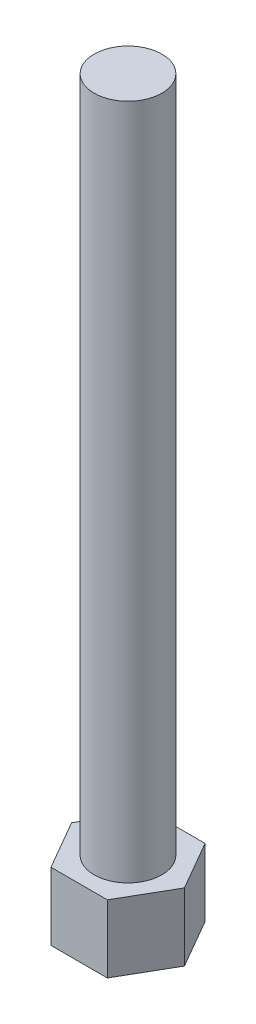
ISO-10303-21;
HEADER;
FILE_DESCRIPTION(('STEP AP214'),'2;1');
FILE_NAME('part.step','',(''),(''),'','','');
FILE_SCHEMA(('AUTOMOTIVE_DESIGN { 1 0 10303 214 1 1 1 1 }'));
ENDSEC;
DATA;
#1=APPLICATION_CONTEXT('core data for automotive mechanical design processes');
#2=APPLICATION_PROTOCOL_DEFINITION('international standard','automotive_design',2000,#1);
#3=PRODUCT_CONTEXT('',#1,'mechanical');
#4=PRODUCT('Part','Part','',(#3));
#5=PRODUCT_RELATED_PRODUCT_CATEGORY('part','',(#4));
#6=PRODUCT_DEFINITION_FORMATION('','',#4);
#7=PRODUCT_DEFINITION_CONTEXT('part definition',#1,'design');
#8=PRODUCT_DEFINITION('design','',#6,#7);
#9=PRODUCT_DEFINITION_SHAPE('','',#8);
#10=(LENGTH_UNIT() NAMED_UNIT(*) SI_UNIT(.MILLI.,.METRE.));
#11=(NAMED_UNIT(*) PLANE_ANGLE_UNIT() SI_UNIT($,.RADIAN.));
#12=(NAMED_UNIT(*) SI_UNIT($,.STERADIAN.) SOLID_ANGLE_UNIT());
#13=UNCERTAINTY_MEASURE_WITH_UNIT(LENGTH_MEASURE(1.E-05),#10,'distance_accuracy_value','');
#14=(GEOMETRIC_REPRESENTATION_CONTEXT(3) GLOBAL_UNCERTAINTY_ASSIGNED_CONTEXT((#13)) GLOBAL_UNIT_ASSIGNED_CONTEXT((#10,
#11,#12)) REPRESENTATION_CONTEXT('',''));
#15=CARTESIAN_POINT('',(0.,0.,0.));
#16=DIRECTION('',(0.,0.,1.));
#17=DIRECTION('',(1.,0.,0.));
#18=AXIS2_PLACEMENT_3D('',#15,#16,#17);
#19=CARTESIAN_POINT('',(0.,30.,0.));
#20=DIRECTION('',(0.,-1.,0.));
#21=DIRECTION('',(0.,0.,-1.));
#22=AXIS2_PLACEMENT_3D('',#19,#20,#21);
#23=CYLINDRICAL_SURFACE('',#22,1.5);
#24=CARTESIAN_POINT('',(0.,30.,0.));
#25=DIRECTION('',(0.,1.,0.));
#26=DIRECTION('',(0.,0.,1.));
#27=AXIS2_PLACEMENT_3D('',#24,#25,#26);
#28=CIRCLE('',#27,1.5);
#29=CARTESIAN_POINT('',(0.,30.,1.5));
#30=VERTEX_POINT('',#29);
#31=EDGE_CURVE('E11',#30,#30,#28,.T.);
#32=ORIENTED_EDGE('',*,*,#31,.F.);
#33=EDGE_LOOP('',(#32));
#34=FACE_BOUND('',#33,.T.);
#35=CARTESIAN_POINT('',(0.,0.,0.));
#36=DIRECTION('',(0.,1.,0.));
#37=DIRECTION('',(0.,0.,1.));
#38=AXIS2_PLACEMENT_3D('',#35,#36,#37);
#39=CIRCLE('',#38,1.5);
#40=CARTESIAN_POINT('',(0.,0.,1.5));
#41=VERTEX_POINT('',#40);
#42=EDGE_CURVE('E44',#41,#41,#39,.T.);
#43=ORIENTED_EDGE('',*,*,#42,.T.);
#44=EDGE_LOOP('',(#43));
#45=FACE_BOUND('',#44,.T.);
#46=ADVANCED_FACE('F41',(#34,#45),#23,.T.);
#47=CARTESIAN_POINT('',(0.,30.,0.));
#48=DIRECTION('',(0.,1.,0.));
#49=DIRECTION('',(0.,0.,1.));
#50=AXIS2_PLACEMENT_3D('',#47,#48,#49);
#51=PLANE('',#50);
#52=ORIENTED_EDGE('',*,*,#31,.T.);
#53=EDGE_LOOP('',(#52));
#54=FACE_BOUND('',#53,.T.);
#55=ADVANCED_FACE('F168',(#54),#51,.T.);
#56=CARTESIAN_POINT('',(-1.25,-3.,-2.1650635094611));
#57=DIRECTION('',(0.,0.,1.));
#58=DIRECTION('',(1.,0.,0.));
#59=AXIS2_PLACEMENT_3D('',#56,#57,#58);
#60=PLANE('',#59);
#61=DIRECTION('',(1.,0.,0.));
#62=VECTOR('',#61,1.);
#63=CARTESIAN_POINT('',(-1.25,0.,-2.1650635094611));
#64=LINE('',#63,#62);
#65=CARTESIAN_POINT('',(-1.25,0.,-2.1650635094611));
#66=VERTEX_POINT('',#65);
#67=CARTESIAN_POINT('',(1.25,0.,-2.1650635094611));
#68=VERTEX_POINT('',#67);
#69=EDGE_CURVE('E126',#66,#68,#64,.T.);
#70=ORIENTED_EDGE('',*,*,#69,.T.);
#71=DIRECTION('',(0.,1.,0.));
#72=VECTOR('',#71,1.);
#73=CARTESIAN_POINT('',(1.25,-3.,-2.1650635094611));
#74=LINE('',#73,#72);
#75=CARTESIAN_POINT('',(1.25,-3.,-2.1650635094611));
#76=VERTEX_POINT('',#75);
#77=EDGE_CURVE('E143',#76,#68,#74,.T.);
#78=ORIENTED_EDGE('',*,*,#77,.F.);
#79=DIRECTION('',(1.,0.,0.));
#80=VECTOR('',#79,1.);
#81=CARTESIAN_POINT('',(-1.25,-3.,-2.1650635094611));
#82=LINE('',#81,#80);
#83=CARTESIAN_POINT('',(-1.25,-3.,-2.1650635094611));
#84=VERTEX_POINT('',#83);
#85=EDGE_CURVE('E136',#84,#76,#82,.T.);
#86=ORIENTED_EDGE('',*,*,#85,.F.);
#87=DIRECTION('',(0.,1.,0.));
#88=VECTOR('',#87,1.);
#89=CARTESIAN_POINT('',(-1.25,-3.,-2.1650635094611));
#90=LINE('',#89,#88);
#91=EDGE_CURVE('E122',#84,#66,#90,.T.);
#92=ORIENTED_EDGE('',*,*,#91,.T.);
#93=EDGE_LOOP('',(#70,#78,#86,#92));
#94=FACE_BOUND('',#93,.T.);
#95=ADVANCED_FACE('F156',(#94),#60,.F.);
#96=CARTESIAN_POINT('',(1.25,-3.,-2.1650635094611));
#97=DIRECTION('',(-0.866025403784438,0.,0.5));
#98=DIRECTION('',(0.5,0.,0.866025403784439));
#99=AXIS2_PLACEMENT_3D('',#96,#97,#98);
#100=PLANE('',#99);
#101=DIRECTION('',(0.5,0.,0.866025403784439));
#102=VECTOR('',#101,1.);
#103=CARTESIAN_POINT('',(1.25,0.,-2.1650635094611));
#104=LINE('',#103,#102);
#105=CARTESIAN_POINT('',(2.5,0.,0.));
#106=VERTEX_POINT('',#105);
#107=EDGE_CURVE('E129',#68,#106,#104,.T.);
#108=ORIENTED_EDGE('',*,*,#107,.T.);
#109=DIRECTION('',(0.,1.,0.));
#110=VECTOR('',#109,1.);
#111=CARTESIAN_POINT('',(2.5,-3.,0.));
#112=LINE('',#111,#110);
#113=CARTESIAN_POINT('',(2.5,-3.,0.));
#114=VERTEX_POINT('',#113);
#115=EDGE_CURVE('E140',#114,#106,#112,.T.);
#116=ORIENTED_EDGE('',*,*,#115,.F.);
#117=DIRECTION('',(0.5,0.,0.866025403784439));
#118=VECTOR('',#117,1.);
#119=CARTESIAN_POINT('',(1.25,-3.,-2.1650635094611));
#120=LINE('',#119,#118);
#121=EDGE_CURVE('E95',#76,#114,#120,.T.);
#122=ORIENTED_EDGE('',*,*,#121,.F.);
#123=ORIENTED_EDGE('',*,*,#77,.T.);
#124=EDGE_LOOP('',(#108,#116,#122,#123));
#125=FACE_BOUND('',#124,.T.);
#126=ADVANCED_FACE('F178',(#125),#100,.F.);
#127=CARTESIAN_POINT('',(2.5,-3.,0.));
#128=DIRECTION('',(-0.866025403784439,0.,-0.5));
#129=DIRECTION('',(-0.5,0.,0.866025403784439));
#130=AXIS2_PLACEMENT_3D('',#127,#128,#129);
#131=PLANE('',#130);
#132=DIRECTION('',(-0.5,0.,0.866025403784439));
#133=VECTOR('',#132,1.);
#134=CARTESIAN_POINT('',(2.5,0.,0.));
#135=LINE('',#134,#133);
#136=CARTESIAN_POINT('',(1.25,0.,2.1650635094611));
#137=VERTEX_POINT('',#136);
#138=EDGE_CURVE('E131',#106,#137,#135,.T.);
#139=ORIENTED_EDGE('',*,*,#138,.T.);
#140=DIRECTION('',(0.,1.,0.));
#141=VECTOR('',#140,1.);
#142=CARTESIAN_POINT('',(1.25,-3.,2.1650635094611));
#143=LINE('',#142,#141);
#144=CARTESIAN_POINT('',(1.25,-3.,2.1650635094611));
#145=VERTEX_POINT('',#144);
#146=EDGE_CURVE('E117',#145,#137,#143,.T.);
#147=ORIENTED_EDGE('',*,*,#146,.F.);
#148=DIRECTION('',(-0.5,0.,0.866025403784439));
#149=VECTOR('',#148,1.);
#150=CARTESIAN_POINT('',(2.5,-3.,0.));
#151=LINE('',#150,#149);
#152=EDGE_CURVE('E108',#114,#145,#151,.T.);
#153=ORIENTED_EDGE('',*,*,#152,.F.);
#154=ORIENTED_EDGE('',*,*,#115,.T.);
#155=EDGE_LOOP('',(#139,#147,#153,#154));
#156=FACE_BOUND('',#155,.T.);
#157=ADVANCED_FACE('F183',(#156),#131,.F.);
#158=CARTESIAN_POINT('',(1.25,-3.,2.1650635094611));
#159=DIRECTION('',(0.,0.,-1.));
#160=DIRECTION('',(-1.,0.,0.));
#161=AXIS2_PLACEMENT_3D('',#158,#159,#160);
#162=PLANE('',#161);
#163=DIRECTION('',(-1.,0.,0.));
#164=VECTOR('',#163,1.);
#165=CARTESIAN_POINT('',(1.25,0.,2.1650635094611));
#166=LINE('',#165,#164);
#167=CARTESIAN_POINT('',(-1.25,0.,2.1650635094611));
#168=VERTEX_POINT('',#167);
#169=EDGE_CURVE('E116',#137,#168,#166,.T.);
#170=ORIENTED_EDGE('',*,*,#169,.T.);
#171=DIRECTION('',(0.,1.,0.));
#172=VECTOR('',#171,1.);
#173=CARTESIAN_POINT('',(-1.25,-3.,2.1650635094611));
#174=LINE('',#173,#172);
#175=CARTESIAN_POINT('',(-1.25,-3.,2.1650635094611));
#176=VERTEX_POINT('',#175);
#177=EDGE_CURVE('E113',#176,#168,#174,.T.);
#178=ORIENTED_EDGE('',*,*,#177,.F.);
#179=DIRECTION('',(-1.,0.,0.));
#180=VECTOR('',#179,1.);
#181=CARTESIAN_POINT('',(1.25,-3.,2.1650635094611));
#182=LINE('',#181,#180);
#183=EDGE_CURVE('E102',#145,#176,#182,.T.);
#184=ORIENTED_EDGE('',*,*,#183,.F.);
#185=ORIENTED_EDGE('',*,*,#146,.T.);
#186=EDGE_LOOP('',(#170,#178,#184,#185));
#187=FACE_BOUND('',#186,.T.);
#188=ADVANCED_FACE('F114',(#187),#162,.F.);
#189=CARTESIAN_POINT('',(-1.25,-3.,2.1650635094611));
#190=DIRECTION('',(0.866025403784439,0.,-0.5));
#191=DIRECTION('',(-0.5,0.,-0.866025403784439));
#192=AXIS2_PLACEMENT_3D('',#189,#190,#191);
#193=PLANE('',#192);
#194=DIRECTION('',(-0.5,0.,-0.866025403784438));
#195=VECTOR('',#194,1.);
#196=CARTESIAN_POINT('',(-1.25,0.,2.1650635094611));
#197=LINE('',#196,#195);
#198=CARTESIAN_POINT('',(-2.5,0.,0.));
#199=VERTEX_POINT('',#198);
#200=EDGE_CURVE('E80',#168,#199,#197,.T.);
#201=ORIENTED_EDGE('',*,*,#200,.T.);
#202=DIRECTION('',(0.,1.,0.));
#203=VECTOR('',#202,1.);
#204=CARTESIAN_POINT('',(-2.5,-3.,0.));
#205=LINE('',#204,#203);
#206=CARTESIAN_POINT('',(-2.5,-3.,0.));
#207=VERTEX_POINT('',#206);
#208=EDGE_CURVE('E118',#207,#199,#205,.T.);
#209=ORIENTED_EDGE('',*,*,#208,.F.);
#210=DIRECTION('',(-0.5,0.,-0.866025403784438));
#211=VECTOR('',#210,1.);
#212=CARTESIAN_POINT('',(-1.25,-3.,2.1650635094611));
#213=LINE('',#212,#211);
#214=EDGE_CURVE('E106',#176,#207,#213,.T.);
#215=ORIENTED_EDGE('',*,*,#214,.F.);
#216=ORIENTED_EDGE('',*,*,#177,.T.);
#217=EDGE_LOOP('',(#201,#209,#215,#216));
#218=FACE_BOUND('',#217,.T.);
#219=ADVANCED_FACE('F120',(#218),#193,.F.);
#220=CARTESIAN_POINT('',(-2.5,-3.,0.));
#221=DIRECTION('',(0.866025403784439,0.,0.5));
#222=DIRECTION('',(0.5,0.,-0.866025403784439));
#223=AXIS2_PLACEMENT_3D('',#220,#221,#222);
#224=PLANE('',#223);
#225=DIRECTION('',(0.5,0.,-0.866025403784439));
#226=VECTOR('',#225,1.);
#227=CARTESIAN_POINT('',(-2.5,0.,0.));
#228=LINE('',#227,#226);
#229=EDGE_CURVE('E86',#199,#66,#228,.T.);
#230=ORIENTED_EDGE('',*,*,#229,.T.);
#231=ORIENTED_EDGE('',*,*,#91,.F.);
#232=DIRECTION('',(0.5,0.,-0.866025403784439));
#233=VECTOR('',#232,1.);
#234=CARTESIAN_POINT('',(-2.5,-3.,0.));
#235=LINE('',#234,#233);
#236=EDGE_CURVE('E57',#207,#84,#235,.T.);
#237=ORIENTED_EDGE('',*,*,#236,.F.);
#238=ORIENTED_EDGE('',*,*,#208,.T.);
#239=EDGE_LOOP('',(#230,#231,#237,#238));
#240=FACE_BOUND('',#239,.T.);
#241=ADVANCED_FACE('F158',(#240),#224,.F.);
#242=CARTESIAN_POINT('',(0.,-3.,0.));
#243=DIRECTION('',(0.,-1.,0.));
#244=DIRECTION('',(0.,0.,-1.));
#245=AXIS2_PLACEMENT_3D('',#242,#243,#244);
#246=PLANE('',#245);
#247=ORIENTED_EDGE('',*,*,#85,.T.);
#248=ORIENTED_EDGE('',*,*,#121,.T.);
#249=ORIENTED_EDGE('',*,*,#152,.T.);
#250=ORIENTED_EDGE('',*,*,#183,.T.);
#251=ORIENTED_EDGE('',*,*,#214,.T.);
#252=ORIENTED_EDGE('',*,*,#236,.T.);
#253=EDGE_LOOP('',(#247,#248,#249,#250,#251,#252));
#254=FACE_BOUND('',#253,.T.);
#255=ADVANCED_FACE('F104',(#254),#246,.T.);
#256=CARTESIAN_POINT('',(0.,0.,0.));
#257=DIRECTION('',(0.,-1.,0.));
#258=DIRECTION('',(0.,0.,-1.));
#259=AXIS2_PLACEMENT_3D('',#256,#257,#258);
#260=PLANE('',#259);
#261=ORIENTED_EDGE('',*,*,#42,.F.);
#262=EDGE_LOOP('',(#261));
#263=FACE_BOUND('',#262,.T.);
#264=ORIENTED_EDGE('',*,*,#69,.F.);
#265=ORIENTED_EDGE('',*,*,#229,.F.);
#266=ORIENTED_EDGE('',*,*,#200,.F.);
#267=ORIENTED_EDGE('',*,*,#169,.F.);
#268=ORIENTED_EDGE('',*,*,#138,.F.);
#269=ORIENTED_EDGE('',*,*,#107,.F.);
#270=EDGE_LOOP('',(#264,#265,#266,#267,#268,#269));
#271=FACE_BOUND('',#270,.T.);
#272=ADVANCED_FACE('F149',(#263,#271),#260,.F.);
#273=CLOSED_SHELL('',(#46,#55,#95,#126,#157,#188,#219,#241,#255,#272));
#274=MANIFOLD_SOLID_BREP('B2',#273);
#275=ADVANCED_BREP_SHAPE_REPRESENTATION('',(#18,#274),#14);
#276=SHAPE_DEFINITION_REPRESENTATION(#9,#275);
ENDSEC;
END-ISO-10303-21;
